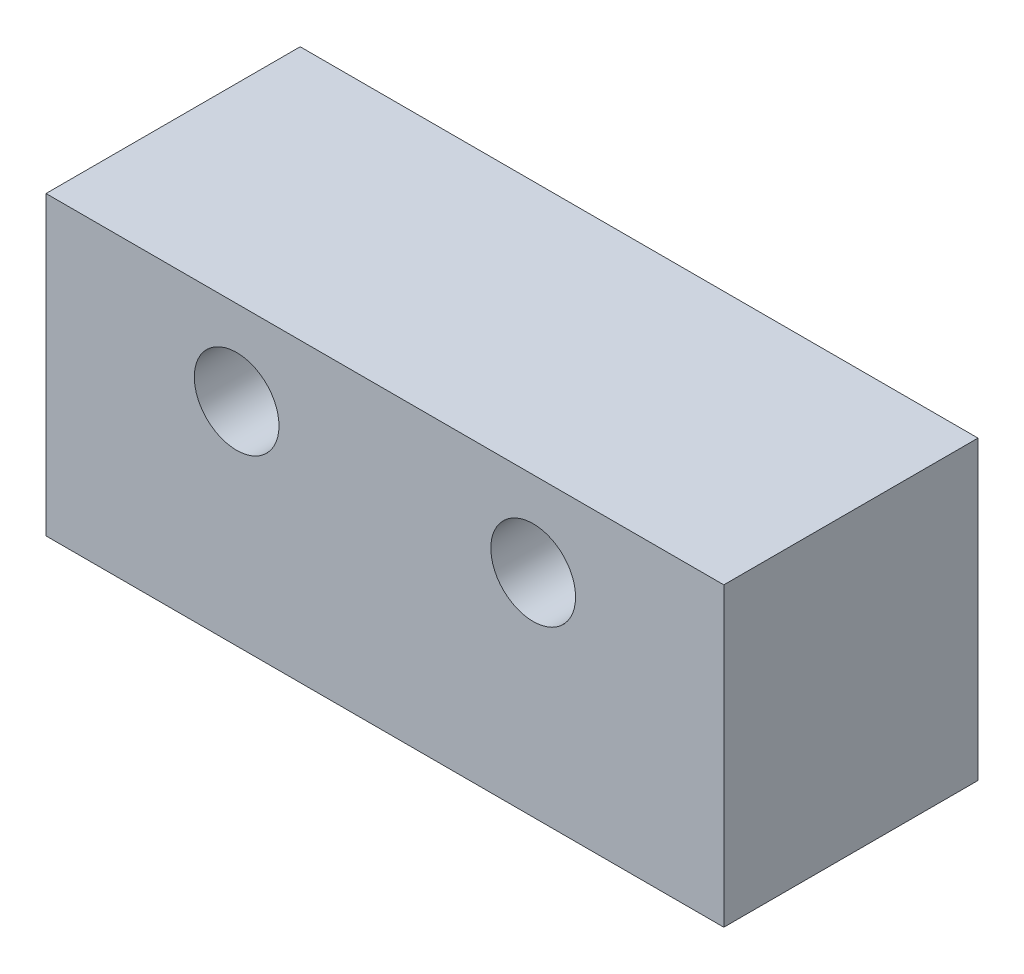
ISO-10303-21;
HEADER;
FILE_DESCRIPTION(('STEP AP214'),'2;1');
FILE_NAME('part.step','',(''),(''),'','','');
FILE_SCHEMA(('AUTOMOTIVE_DESIGN { 1 0 10303 214 1 1 1 1 }'));
ENDSEC;
DATA;
#1=APPLICATION_CONTEXT('core data for automotive mechanical design processes');
#2=APPLICATION_PROTOCOL_DEFINITION('international standard','automotive_design',2000,#1);
#3=PRODUCT_CONTEXT('',#1,'mechanical');
#4=PRODUCT('Part','Part','',(#3));
#5=PRODUCT_RELATED_PRODUCT_CATEGORY('part','',(#4));
#6=PRODUCT_DEFINITION_FORMATION('','',#4);
#7=PRODUCT_DEFINITION_CONTEXT('part definition',#1,'design');
#8=PRODUCT_DEFINITION('design','',#6,#7);
#9=PRODUCT_DEFINITION_SHAPE('','',#8);
#10=(LENGTH_UNIT() NAMED_UNIT(*) SI_UNIT(.MILLI.,.METRE.));
#11=(NAMED_UNIT(*) PLANE_ANGLE_UNIT() SI_UNIT($,.RADIAN.));
#12=(NAMED_UNIT(*) SI_UNIT($,.STERADIAN.) SOLID_ANGLE_UNIT());
#13=UNCERTAINTY_MEASURE_WITH_UNIT(LENGTH_MEASURE(1.E-05),#10,'distance_accuracy_value','');
#14=(GEOMETRIC_REPRESENTATION_CONTEXT(3) GLOBAL_UNCERTAINTY_ASSIGNED_CONTEXT((#13)) GLOBAL_UNIT_ASSIGNED_CONTEXT((#10,
#11,#12)) REPRESENTATION_CONTEXT('',''));
#15=CARTESIAN_POINT('',(0.,0.,0.));
#16=DIRECTION('',(0.,0.,1.));
#17=DIRECTION('',(1.,0.,0.));
#18=AXIS2_PLACEMENT_3D('',#15,#16,#17);
#19=CARTESIAN_POINT('',(0.,0.,3.));
#20=DIRECTION('',(0.,0.,1.));
#21=DIRECTION('',(1.,0.,0.));
#22=AXIS2_PLACEMENT_3D('',#19,#20,#21);
#23=PLANE('',#22);
#24=DIRECTION('',(1.,0.,0.));
#25=VECTOR('',#24,1.);
#26=CARTESIAN_POINT('',(0.,2.,3.));
#27=LINE('',#26,#25);
#28=CARTESIAN_POINT('',(-8.,2.,3.));
#29=VERTEX_POINT('',#28);
#30=CARTESIAN_POINT('',(8.,2.,3.));
#31=VERTEX_POINT('',#30);
#32=EDGE_CURVE('E53',#29,#31,#27,.T.);
#33=ORIENTED_EDGE('',*,*,#32,.F.);
#34=DIRECTION('',(0.,-1.,0.));
#35=VECTOR('',#34,1.);
#36=CARTESIAN_POINT('',(-8.,-5.,3.));
#37=LINE('',#36,#35);
#38=CARTESIAN_POINT('',(-8.,-5.,3.));
#39=VERTEX_POINT('',#38);
#40=EDGE_CURVE('E97',#29,#39,#37,.T.);
#41=ORIENTED_EDGE('',*,*,#40,.T.);
#42=DIRECTION('',(1.,0.,0.));
#43=VECTOR('',#42,1.);
#44=CARTESIAN_POINT('',(-8.,-5.,3.));
#45=LINE('',#44,#43);
#46=CARTESIAN_POINT('',(8.,-5.,3.));
#47=VERTEX_POINT('',#46);
#48=EDGE_CURVE('E61',#39,#47,#45,.T.);
#49=ORIENTED_EDGE('',*,*,#48,.T.);
#50=DIRECTION('',(0.,1.,0.));
#51=VECTOR('',#50,1.);
#52=CARTESIAN_POINT('',(8.,-5.,3.));
#53=LINE('',#52,#51);
#54=EDGE_CURVE('E90',#47,#31,#53,.T.);
#55=ORIENTED_EDGE('',*,*,#54,.T.);
#56=EDGE_LOOP('',(#33,#41,#49,#55));
#57=FACE_BOUND('',#56,.T.);
#58=CARTESIAN_POINT('',(-3.49999999999641,0.,3.));
#59=DIRECTION('',(0.,0.,1.));
#60=DIRECTION('',(1.,0.,0.));
#61=AXIS2_PLACEMENT_3D('',#58,#59,#60);
#62=CIRCLE('',#61,1.);
#63=CARTESIAN_POINT('',(-2.49999999999641,0.,3.));
#64=VERTEX_POINT('',#63);
#65=EDGE_CURVE('E119',#64,#64,#62,.T.);
#66=ORIENTED_EDGE('',*,*,#65,.F.);
#67=EDGE_LOOP('',(#66));
#68=FACE_BOUND('',#67,.T.);
#69=CARTESIAN_POINT('',(3.49999999999641,0.,3.));
#70=DIRECTION('',(0.,0.,1.));
#71=DIRECTION('',(1.,0.,0.));
#72=AXIS2_PLACEMENT_3D('',#69,#70,#71);
#73=CIRCLE('',#72,1.);
#74=CARTESIAN_POINT('',(4.49999999999641,0.,3.));
#75=VERTEX_POINT('',#74);
#76=EDGE_CURVE('E106',#75,#75,#73,.F.);
#77=ORIENTED_EDGE('',*,*,#76,.T.);
#78=EDGE_LOOP('',(#77));
#79=FACE_BOUND('',#78,.T.);
#80=ADVANCED_FACE('F38',(#57,#68,#79),#23,.T.);
#81=CARTESIAN_POINT('',(0.,0.,-3.));
#82=DIRECTION('',(0.,0.,1.));
#83=DIRECTION('',(1.,0.,0.));
#84=AXIS2_PLACEMENT_3D('',#81,#82,#83);
#85=PLANE('',#84);
#86=CARTESIAN_POINT('',(-3.49999999999641,0.,-3.));
#87=DIRECTION('',(0.,0.,1.));
#88=DIRECTION('',(1.,0.,0.));
#89=AXIS2_PLACEMENT_3D('',#86,#87,#88);
#90=CIRCLE('',#89,1.);
#91=CARTESIAN_POINT('',(-2.49999999999641,0.,-3.));
#92=VERTEX_POINT('',#91);
#93=EDGE_CURVE('E103',#92,#92,#90,.T.);
#94=ORIENTED_EDGE('',*,*,#93,.T.);
#95=EDGE_LOOP('',(#94));
#96=FACE_BOUND('',#95,.T.);
#97=DIRECTION('',(0.,-1.,0.));
#98=VECTOR('',#97,1.);
#99=CARTESIAN_POINT('',(-8.,-5.,-3.));
#100=LINE('',#99,#98);
#101=CARTESIAN_POINT('',(-8.,2.,-3.));
#102=VERTEX_POINT('',#101);
#103=CARTESIAN_POINT('',(-8.,-5.,-3.));
#104=VERTEX_POINT('',#103);
#105=EDGE_CURVE('E84',#102,#104,#100,.T.);
#106=ORIENTED_EDGE('',*,*,#105,.F.);
#107=DIRECTION('',(1.,0.,0.));
#108=VECTOR('',#107,1.);
#109=CARTESIAN_POINT('',(0.,2.,-3.));
#110=LINE('',#109,#108);
#111=CARTESIAN_POINT('',(8.,2.,-3.));
#112=VERTEX_POINT('',#111);
#113=EDGE_CURVE('E96',#102,#112,#110,.T.);
#114=ORIENTED_EDGE('',*,*,#113,.T.);
#115=DIRECTION('',(0.,1.,0.));
#116=VECTOR('',#115,1.);
#117=CARTESIAN_POINT('',(8.,-5.,-3.));
#118=LINE('',#117,#116);
#119=CARTESIAN_POINT('',(8.,-5.,-3.));
#120=VERTEX_POINT('',#119);
#121=EDGE_CURVE('E83',#120,#112,#118,.T.);
#122=ORIENTED_EDGE('',*,*,#121,.F.);
#123=DIRECTION('',(1.,0.,0.));
#124=VECTOR('',#123,1.);
#125=CARTESIAN_POINT('',(-8.,-5.,-3.));
#126=LINE('',#125,#124);
#127=EDGE_CURVE('E74',#104,#120,#126,.T.);
#128=ORIENTED_EDGE('',*,*,#127,.F.);
#129=EDGE_LOOP('',(#106,#114,#122,#128));
#130=FACE_BOUND('',#129,.T.);
#131=CARTESIAN_POINT('',(3.49999999999641,0.,-3.));
#132=DIRECTION('',(0.,0.,1.));
#133=DIRECTION('',(1.,0.,0.));
#134=AXIS2_PLACEMENT_3D('',#131,#132,#133);
#135=CIRCLE('',#134,1.);
#136=CARTESIAN_POINT('',(4.49999999999641,0.,-3.));
#137=VERTEX_POINT('',#136);
#138=EDGE_CURVE('E105',#137,#137,#135,.F.);
#139=ORIENTED_EDGE('',*,*,#138,.F.);
#140=EDGE_LOOP('',(#139));
#141=FACE_BOUND('',#140,.T.);
#142=ADVANCED_FACE('F93',(#96,#130,#141),#85,.F.);
#143=CARTESIAN_POINT('',(-8.,-5.,3.));
#144=DIRECTION('',(1.,0.,0.));
#145=DIRECTION('',(0.,0.,-1.));
#146=AXIS2_PLACEMENT_3D('',#143,#144,#145);
#147=PLANE('',#146);
#148=ORIENTED_EDGE('',*,*,#40,.F.);
#149=DIRECTION('',(0.,0.,-1.));
#150=VECTOR('',#149,1.);
#151=CARTESIAN_POINT('',(-8.,2.,3.));
#152=LINE('',#151,#150);
#153=EDGE_CURVE('E127',#29,#102,#152,.T.);
#154=ORIENTED_EDGE('',*,*,#153,.T.);
#155=ORIENTED_EDGE('',*,*,#105,.T.);
#156=DIRECTION('',(0.,0.,-1.));
#157=VECTOR('',#156,1.);
#158=CARTESIAN_POINT('',(-8.,-5.,3.));
#159=LINE('',#158,#157);
#160=EDGE_CURVE('E46',#39,#104,#159,.T.);
#161=ORIENTED_EDGE('',*,*,#160,.F.);
#162=EDGE_LOOP('',(#148,#154,#155,#161));
#163=FACE_BOUND('',#162,.T.);
#164=ADVANCED_FACE('F40',(#163),#147,.F.);
#165=CARTESIAN_POINT('',(-8.,-5.,3.));
#166=DIRECTION('',(0.,1.,0.));
#167=DIRECTION('',(0.,0.,1.));
#168=AXIS2_PLACEMENT_3D('',#165,#166,#167);
#169=PLANE('',#168);
#170=CARTESIAN_POINT('',(0.,-5.,0.));
#171=DIRECTION('',(0.,-1.,0.));
#172=DIRECTION('',(0.,0.,-1.));
#173=AXIS2_PLACEMENT_3D('',#170,#171,#172);
#174=CIRCLE('',#173,2.);
#175=CARTESIAN_POINT('',(0.,-5.,-2.));
#176=VERTEX_POINT('',#175);
#177=EDGE_CURVE('E108',#176,#176,#174,.T.);
#178=ORIENTED_EDGE('',*,*,#177,.F.);
#179=EDGE_LOOP('',(#178));
#180=FACE_BOUND('',#179,.T.);
#181=ORIENTED_EDGE('',*,*,#127,.T.);
#182=DIRECTION('',(0.,0.,-1.));
#183=VECTOR('',#182,1.);
#184=CARTESIAN_POINT('',(8.,-5.,3.));
#185=LINE('',#184,#183);
#186=EDGE_CURVE('E77',#47,#120,#185,.T.);
#187=ORIENTED_EDGE('',*,*,#186,.F.);
#188=ORIENTED_EDGE('',*,*,#48,.F.);
#189=ORIENTED_EDGE('',*,*,#160,.T.);
#190=EDGE_LOOP('',(#181,#187,#188,#189));
#191=FACE_BOUND('',#190,.T.);
#192=ADVANCED_FACE('F76',(#180,#191),#169,.F.);
#193=CARTESIAN_POINT('',(8.,-5.,3.));
#194=DIRECTION('',(-1.,0.,0.));
#195=DIRECTION('',(0.,0.,1.));
#196=AXIS2_PLACEMENT_3D('',#193,#194,#195);
#197=PLANE('',#196);
#198=ORIENTED_EDGE('',*,*,#121,.T.);
#199=DIRECTION('',(0.,0.,1.));
#200=VECTOR('',#199,1.);
#201=CARTESIAN_POINT('',(8.,2.,3.));
#202=LINE('',#201,#200);
#203=EDGE_CURVE('E12',#112,#31,#202,.T.);
#204=ORIENTED_EDGE('',*,*,#203,.T.);
#205=ORIENTED_EDGE('',*,*,#54,.F.);
#206=ORIENTED_EDGE('',*,*,#186,.T.);
#207=EDGE_LOOP('',(#198,#204,#205,#206));
#208=FACE_BOUND('',#207,.T.);
#209=ADVANCED_FACE('F88',(#208),#197,.F.);
#210=CARTESIAN_POINT('',(0.,10.6568542494924,0.));
#211=DIRECTION('',(0.,-1.,0.));
#212=DIRECTION('',(0.,0.,-1.));
#213=AXIS2_PLACEMENT_3D('',#210,#211,#212);
#214=CYLINDRICAL_SURFACE('',#213,2.);
#215=CARTESIAN_POINT('',(0.,0.,0.));
#216=DIRECTION('',(0.,-1.,0.));
#217=DIRECTION('',(0.,0.,-1.));
#218=AXIS2_PLACEMENT_3D('',#215,#216,#217);
#219=CIRCLE('',#218,2.);
#220=CARTESIAN_POINT('',(0.,0.,-2.));
#221=VERTEX_POINT('',#220);
#222=EDGE_CURVE('E112',#221,#221,#219,.F.);
#223=ORIENTED_EDGE('',*,*,#222,.T.);
#224=EDGE_LOOP('',(#223));
#225=FACE_BOUND('',#224,.T.);
#226=ORIENTED_EDGE('',*,*,#177,.T.);
#227=EDGE_LOOP('',(#226));
#228=FACE_BOUND('',#227,.T.);
#229=ADVANCED_FACE('F151',(#225,#228),#214,.F.);
#230=CARTESIAN_POINT('',(-8.,0.,3.));
#231=DIRECTION('',(0.,-1.,0.));
#232=DIRECTION('',(0.,0.,-1.));
#233=AXIS2_PLACEMENT_3D('',#230,#231,#232);
#234=PLANE('',#233);
#235=ORIENTED_EDGE('',*,*,#222,.F.);
#236=EDGE_LOOP('',(#235));
#237=FACE_BOUND('',#236,.T.);
#238=ADVANCED_FACE('F208',(#237),#234,.T.);
#239=CARTESIAN_POINT('',(-3.49999999999641,0.,-7.));
#240=DIRECTION('',(0.,0.,1.));
#241=DIRECTION('',(1.,0.,0.));
#242=AXIS2_PLACEMENT_3D('',#239,#240,#241);
#243=CYLINDRICAL_SURFACE('',#242,1.);
#244=ORIENTED_EDGE('',*,*,#65,.T.);
#245=EDGE_LOOP('',(#244));
#246=FACE_BOUND('',#245,.T.);
#247=ORIENTED_EDGE('',*,*,#93,.F.);
#248=EDGE_LOOP('',(#247));
#249=FACE_BOUND('',#248,.T.);
#250=ADVANCED_FACE('F141',(#246,#249),#243,.F.);
#251=CARTESIAN_POINT('',(3.49999999999641,0.,-7.));
#252=DIRECTION('',(0.,0.,1.));
#253=DIRECTION('',(1.,0.,0.));
#254=AXIS2_PLACEMENT_3D('',#251,#252,#253);
#255=CYLINDRICAL_SURFACE('',#254,1.);
#256=ORIENTED_EDGE('',*,*,#76,.F.);
#257=EDGE_LOOP('',(#256));
#258=FACE_BOUND('',#257,.T.);
#259=ORIENTED_EDGE('',*,*,#138,.T.);
#260=EDGE_LOOP('',(#259));
#261=FACE_BOUND('',#260,.T.);
#262=ADVANCED_FACE('F192',(#258,#261),#255,.F.);
#263=CARTESIAN_POINT('',(0.,2.,0.));
#264=DIRECTION('',(0.,-1.,0.));
#265=DIRECTION('',(0.,0.,-1.));
#266=AXIS2_PLACEMENT_3D('',#263,#264,#265);
#267=PLANE('',#266);
#268=ORIENTED_EDGE('',*,*,#32,.T.);
#269=ORIENTED_EDGE('',*,*,#203,.F.);
#270=ORIENTED_EDGE('',*,*,#113,.F.);
#271=ORIENTED_EDGE('',*,*,#153,.F.);
#272=EDGE_LOOP('',(#268,#269,#270,#271));
#273=FACE_BOUND('',#272,.T.);
#274=ADVANCED_FACE('F130',(#273),#267,.F.);
#275=CLOSED_SHELL('',(#80,#142,#164,#192,#209,#229,#238,#250,#262,#274));
#276=MANIFOLD_SOLID_BREP('B2',#275);
#277=ADVANCED_BREP_SHAPE_REPRESENTATION('',(#18,#276),#14);
#278=SHAPE_DEFINITION_REPRESENTATION(#9,#277);
ENDSEC;
END-ISO-10303-21;
